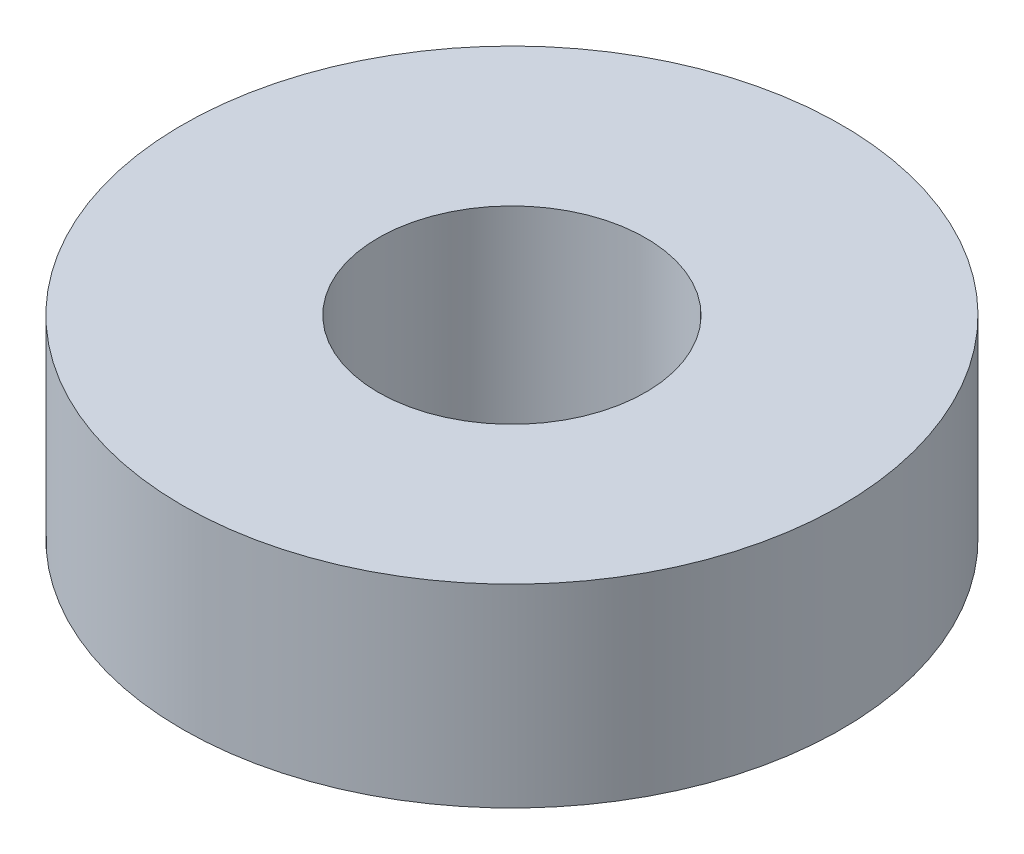
ISO-10303-21;
HEADER;
FILE_DESCRIPTION(('STEP AP214'),'2;1');
FILE_NAME('part.step','',(''),(''),'','','');
FILE_SCHEMA(('AUTOMOTIVE_DESIGN { 1 0 10303 214 1 1 1 1 }'));
ENDSEC;
DATA;
#1=APPLICATION_CONTEXT('core data for automotive mechanical design processes');
#2=APPLICATION_PROTOCOL_DEFINITION('international standard','automotive_design',2000,#1);
#3=PRODUCT_CONTEXT('',#1,'mechanical');
#4=PRODUCT('Part','Part','',(#3));
#5=PRODUCT_RELATED_PRODUCT_CATEGORY('part','',(#4));
#6=PRODUCT_DEFINITION_FORMATION('','',#4);
#7=PRODUCT_DEFINITION_CONTEXT('part definition',#1,'design');
#8=PRODUCT_DEFINITION('design','',#6,#7);
#9=PRODUCT_DEFINITION_SHAPE('','',#8);
#10=(LENGTH_UNIT() NAMED_UNIT(*) SI_UNIT(.MILLI.,.METRE.));
#11=(NAMED_UNIT(*) PLANE_ANGLE_UNIT() SI_UNIT($,.RADIAN.));
#12=(NAMED_UNIT(*) SI_UNIT($,.STERADIAN.) SOLID_ANGLE_UNIT());
#13=UNCERTAINTY_MEASURE_WITH_UNIT(LENGTH_MEASURE(1.E-05),#10,'distance_accuracy_value','');
#14=(GEOMETRIC_REPRESENTATION_CONTEXT(3) GLOBAL_UNCERTAINTY_ASSIGNED_CONTEXT((#13)) GLOBAL_UNIT_ASSIGNED_CONTEXT((#10,
#11,#12)) REPRESENTATION_CONTEXT('',''));
#15=CARTESIAN_POINT('',(0.,0.,0.));
#16=DIRECTION('',(0.,0.,1.));
#17=DIRECTION('',(1.,0.,0.));
#18=AXIS2_PLACEMENT_3D('',#15,#16,#17);
#19=CARTESIAN_POINT('',(0.,5.,0.));
#20=DIRECTION('',(0.,1.,0.));
#21=DIRECTION('',(0.,0.,1.));
#22=AXIS2_PLACEMENT_3D('',#19,#20,#21);
#23=PLANE('',#22);
#24=CARTESIAN_POINT('',(0.,5.,0.));
#25=DIRECTION('',(0.,1.,0.));
#26=DIRECTION('',(0.,0.,1.));
#27=AXIS2_PLACEMENT_3D('',#24,#25,#26);
#28=CIRCLE('',#27,8.5);
#29=CARTESIAN_POINT('',(0.,5.,8.5));
#30=VERTEX_POINT('',#29);
#31=EDGE_CURVE('E10',#30,#30,#28,.T.);
#32=ORIENTED_EDGE('',*,*,#31,.T.);
#33=EDGE_LOOP('',(#32));
#34=FACE_BOUND('',#33,.T.);
#35=CARTESIAN_POINT('',(0.,5.,0.));
#36=DIRECTION('',(0.,1.,0.));
#37=DIRECTION('',(0.,0.,1.));
#38=AXIS2_PLACEMENT_3D('',#35,#36,#37);
#39=CIRCLE('',#38,3.45);
#40=CARTESIAN_POINT('',(0.,5.,3.45));
#41=VERTEX_POINT('',#40);
#42=EDGE_CURVE('E45',#41,#41,#39,.T.);
#43=ORIENTED_EDGE('',*,*,#42,.F.);
#44=EDGE_LOOP('',(#43));
#45=FACE_BOUND('',#44,.T.);
#46=ADVANCED_FACE('F34',(#34,#45),#23,.T.);
#47=CARTESIAN_POINT('',(0.,0.,0.));
#48=DIRECTION('',(0.,1.,0.));
#49=DIRECTION('',(0.,0.,1.));
#50=AXIS2_PLACEMENT_3D('',#47,#48,#49);
#51=PLANE('',#50);
#52=CARTESIAN_POINT('',(0.,0.,0.));
#53=DIRECTION('',(0.,1.,0.));
#54=DIRECTION('',(0.,0.,1.));
#55=AXIS2_PLACEMENT_3D('',#52,#53,#54);
#56=CIRCLE('',#55,8.5);
#57=CARTESIAN_POINT('',(0.,0.,8.5));
#58=VERTEX_POINT('',#57);
#59=EDGE_CURVE('E38',#58,#58,#56,.T.);
#60=ORIENTED_EDGE('',*,*,#59,.F.);
#61=EDGE_LOOP('',(#60));
#62=FACE_BOUND('',#61,.T.);
#63=CARTESIAN_POINT('',(0.,0.,0.));
#64=DIRECTION('',(0.,1.,0.));
#65=DIRECTION('',(0.,0.,1.));
#66=AXIS2_PLACEMENT_3D('',#63,#64,#65);
#67=CIRCLE('',#66,3.45);
#68=CARTESIAN_POINT('',(0.,0.,3.45));
#69=VERTEX_POINT('',#68);
#70=EDGE_CURVE('E47',#69,#69,#67,.T.);
#71=ORIENTED_EDGE('',*,*,#70,.T.);
#72=EDGE_LOOP('',(#71));
#73=FACE_BOUND('',#72,.T.);
#74=ADVANCED_FACE('F57',(#62,#73),#51,.F.);
#75=CARTESIAN_POINT('',(0.,5.,0.));
#76=DIRECTION('',(0.,-1.,0.));
#77=DIRECTION('',(0.,0.,-1.));
#78=AXIS2_PLACEMENT_3D('',#75,#76,#77);
#79=CYLINDRICAL_SURFACE('',#78,8.5);
#80=ORIENTED_EDGE('',*,*,#31,.F.);
#81=EDGE_LOOP('',(#80));
#82=FACE_BOUND('',#81,.T.);
#83=ORIENTED_EDGE('',*,*,#59,.T.);
#84=EDGE_LOOP('',(#83));
#85=FACE_BOUND('',#84,.T.);
#86=ADVANCED_FACE('F36',(#82,#85),#79,.T.);
#87=CARTESIAN_POINT('',(0.,5.,0.));
#88=DIRECTION('',(0.,-1.,0.));
#89=DIRECTION('',(0.,0.,-1.));
#90=AXIS2_PLACEMENT_3D('',#87,#88,#89);
#91=CYLINDRICAL_SURFACE('',#90,3.45);
#92=ORIENTED_EDGE('',*,*,#42,.T.);
#93=EDGE_LOOP('',(#92));
#94=FACE_BOUND('',#93,.T.);
#95=ORIENTED_EDGE('',*,*,#70,.F.);
#96=EDGE_LOOP('',(#95));
#97=FACE_BOUND('',#96,.T.);
#98=ADVANCED_FACE('F53',(#94,#97),#91,.F.);
#99=CLOSED_SHELL('',(#46,#74,#86,#98));
#100=MANIFOLD_SOLID_BREP('B2',#99);
#101=ADVANCED_BREP_SHAPE_REPRESENTATION('',(#18,#100),#14);
#102=SHAPE_DEFINITION_REPRESENTATION(#9,#101);
ENDSEC;
END-ISO-10303-21;
